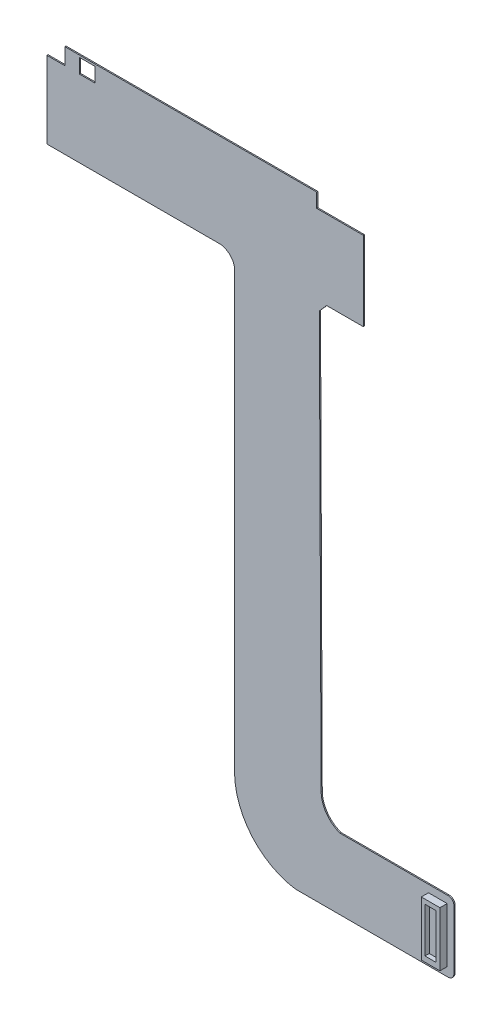
ISO-10303-21;
HEADER;
FILE_DESCRIPTION(('STEP AP214'),'2;1');
FILE_NAME('part.step','',(''),(''),'','','');
FILE_SCHEMA(('AUTOMOTIVE_DESIGN { 1 0 10303 214 1 1 1 1 }'));
ENDSEC;
DATA;
#1=APPLICATION_CONTEXT('core data for automotive mechanical design processes');
#2=APPLICATION_PROTOCOL_DEFINITION('international standard','automotive_design',2000,#1);
#3=PRODUCT_CONTEXT('',#1,'mechanical');
#4=PRODUCT('Part','Part','',(#3));
#5=PRODUCT_RELATED_PRODUCT_CATEGORY('part','',(#4));
#6=PRODUCT_DEFINITION_FORMATION('','',#4);
#7=PRODUCT_DEFINITION_CONTEXT('part definition',#1,'design');
#8=PRODUCT_DEFINITION('design','',#6,#7);
#9=PRODUCT_DEFINITION_SHAPE('','',#8);
#10=(LENGTH_UNIT() NAMED_UNIT(*) SI_UNIT(.MILLI.,.METRE.));
#11=(NAMED_UNIT(*) PLANE_ANGLE_UNIT() SI_UNIT($,.RADIAN.));
#12=(NAMED_UNIT(*) SI_UNIT($,.STERADIAN.) SOLID_ANGLE_UNIT());
#13=UNCERTAINTY_MEASURE_WITH_UNIT(LENGTH_MEASURE(1.E-05),#10,'distance_accuracy_value','');
#14=(GEOMETRIC_REPRESENTATION_CONTEXT(3) GLOBAL_UNCERTAINTY_ASSIGNED_CONTEXT((#13)) GLOBAL_UNIT_ASSIGNED_CONTEXT((#10,
#11,#12)) REPRESENTATION_CONTEXT('',''));
#15=CARTESIAN_POINT('',(0.,0.,0.));
#16=DIRECTION('',(0.,0.,1.));
#17=DIRECTION('',(1.,0.,0.));
#18=AXIS2_PLACEMENT_3D('',#15,#16,#17);
#19=CARTESIAN_POINT('',(153.074119046301,141.992079804937,0.2));
#20=DIRECTION('',(0.,0.,-1.));
#21=DIRECTION('',(-1.,0.,0.));
#22=AXIS2_PLACEMENT_3D('',#19,#20,#21);
#23=PLANE('',#22);
#24=DIRECTION('',(0.,-1.,0.));
#25=VECTOR('',#24,1.);
#26=CARTESIAN_POINT('',(128.905084660618,160.581656664466,0.2));
#27=LINE('',#26,#25);
#28=CARTESIAN_POINT('',(128.905084660618,160.581656664466,0.2));
#29=VERTEX_POINT('',#28);
#30=CARTESIAN_POINT('',(128.905084660618,158.075350221352,0.2));
#31=VERTEX_POINT('',#30);
#32=EDGE_CURVE('E354',#29,#31,#27,.T.);
#33=ORIENTED_EDGE('',*,*,#32,.F.);
#34=DIRECTION('',(-1.,0.,0.));
#35=VECTOR('',#34,1.);
#36=CARTESIAN_POINT('',(128.905084660618,160.581656664466,0.2));
#37=LINE('',#36,#35);
#38=CARTESIAN_POINT('',(131.63078371799,160.581656664466,0.2));
#39=VERTEX_POINT('',#38);
#40=EDGE_CURVE('E365',#39,#29,#37,.T.);
#41=ORIENTED_EDGE('',*,*,#40,.F.);
#42=DIRECTION('',(0.,1.,0.));
#43=VECTOR('',#42,1.);
#44=CARTESIAN_POINT('',(131.63078371799,160.581656664466,0.2));
#45=LINE('',#44,#43);
#46=CARTESIAN_POINT('',(131.63078371799,158.075350221352,0.2));
#47=VERTEX_POINT('',#46);
#48=EDGE_CURVE('E361',#47,#39,#45,.T.);
#49=ORIENTED_EDGE('',*,*,#48,.F.);
#50=DIRECTION('',(1.,0.,0.));
#51=VECTOR('',#50,1.);
#52=CARTESIAN_POINT('',(128.905084660618,158.075350221352,0.2));
#53=LINE('',#52,#51);
#54=EDGE_CURVE('E357',#31,#47,#53,.T.);
#55=ORIENTED_EDGE('',*,*,#54,.F.);
#56=EDGE_LOOP('',(#33,#41,#49,#55));
#57=FACE_BOUND('',#56,.T.);
#58=DIRECTION('',(1.,0.,0.));
#59=VECTOR('',#58,1.);
#60=CARTESIAN_POINT('',(193.829857272871,54.476275086045,0.2));
#61=LINE('',#60,#59);
#62=CARTESIAN_POINT('',(166.335216501354,54.476275086045,0.2));
#63=VERTEX_POINT('',#62);
#64=CARTESIAN_POINT('',(192.829857272871,54.476275086045,0.2));
#65=VERTEX_POINT('',#64);
#66=EDGE_CURVE('E420',#63,#65,#61,.T.);
#67=ORIENTED_EDGE('',*,*,#66,.T.);
#68=CARTESIAN_POINT('',(192.829857272871,55.476275086045,0.2));
#69=DIRECTION('',(0.,0.,-1.));
#70=DIRECTION('',(-1.,0.,0.));
#71=AXIS2_PLACEMENT_3D('',#68,#69,#70);
#72=CIRCLE('',#71,1.);
#73=CARTESIAN_POINT('',(193.829857272871,55.476275086045,0.2));
#74=VERTEX_POINT('',#73);
#75=EDGE_CURVE('E50',#65,#74,#72,.F.);
#76=ORIENTED_EDGE('',*,*,#75,.T.);
#77=DIRECTION('',(0.,1.,0.));
#78=VECTOR('',#77,1.);
#79=CARTESIAN_POINT('',(193.829857272871,66.7210264937508,0.2));
#80=LINE('',#79,#78);
#81=CARTESIAN_POINT('',(193.829857272871,65.7210264937508,0.2));
#82=VERTEX_POINT('',#81);
#83=EDGE_CURVE('E423',#74,#82,#80,.T.);
#84=ORIENTED_EDGE('',*,*,#83,.T.);
#85=CARTESIAN_POINT('',(192.829857272871,65.7210264937508,0.2));
#86=DIRECTION('',(0.,0.,-1.));
#87=DIRECTION('',(-1.,0.,0.));
#88=AXIS2_PLACEMENT_3D('',#85,#86,#87);
#89=CIRCLE('',#88,1.);
#90=CARTESIAN_POINT('',(192.829857272871,66.7210264937508,0.2));
#91=VERTEX_POINT('',#90);
#92=EDGE_CURVE('E57',#82,#91,#89,.F.);
#93=ORIENTED_EDGE('',*,*,#92,.T.);
#94=DIRECTION('',(-1.,0.,0.));
#95=VECTOR('',#94,1.);
#96=CARTESIAN_POINT('',(174.095624510161,66.7210264937508,0.2));
#97=LINE('',#96,#95);
#98=CARTESIAN_POINT('',(174.095624510161,66.7210264937508,0.2));
#99=VERTEX_POINT('',#98);
#100=EDGE_CURVE('E426',#91,#99,#97,.T.);
#101=ORIENTED_EDGE('',*,*,#100,.T.);
#102=CARTESIAN_POINT('',(175.734020057086,71.3549150476266,0.2));
#103=DIRECTION('',(0.,0.,-1.));
#104=DIRECTION('',(1.,0.,0.));
#105=AXIS2_PLACEMENT_3D('',#102,#103,#104);
#106=CIRCLE('',#105,4.91500387567746);
#107=CARTESIAN_POINT('',(170.819971895438,71.2579936210393,0.2));
#108=VERTEX_POINT('',#107);
#109=EDGE_CURVE('E429',#99,#108,#106,.T.);
#110=ORIENTED_EDGE('',*,*,#109,.T.);
#111=DIRECTION('',(-0.00423724986194435,0.999991022816509,0.));
#112=VECTOR('',#111,1.);
#113=CARTESIAN_POINT('',(170.514624307193,143.320028439117,0.2));
#114=LINE('',#113,#112);
#115=CARTESIAN_POINT('',(170.514624307193,143.320028439117,0.2));
#116=VERTEX_POINT('',#115);
#117=EDGE_CURVE('E432',#108,#116,#114,.T.);
#118=ORIENTED_EDGE('',*,*,#117,.T.);
#119=DIRECTION('',(0.660938242989916,0.75044029672813,0.));
#120=VECTOR('',#119,1.);
#121=CARTESIAN_POINT('',(171.779679925594,144.756393672511,0.2));
#122=LINE('',#121,#120);
#123=CARTESIAN_POINT('',(171.779679925594,144.756393672511,0.2));
#124=VERTEX_POINT('',#123);
#125=EDGE_CURVE('E435',#116,#124,#122,.T.);
#126=ORIENTED_EDGE('',*,*,#125,.T.);
#127=DIRECTION('',(1.,0.,0.));
#128=VECTOR('',#127,1.);
#129=CARTESIAN_POINT('',(178.126916217977,144.756393672511,0.2));
#130=LINE('',#129,#128);
#131=CARTESIAN_POINT('',(178.126916217977,144.756393672511,0.2));
#132=VERTEX_POINT('',#131);
#133=EDGE_CURVE('E438',#124,#132,#130,.T.);
#134=ORIENTED_EDGE('',*,*,#133,.T.);
#135=DIRECTION('',(0.,1.,0.));
#136=VECTOR('',#135,1.);
#137=CARTESIAN_POINT('',(178.126916217977,158.481322709896,0.2));
#138=LINE('',#137,#136);
#139=CARTESIAN_POINT('',(178.126916217977,158.481322709896,0.2));
#140=VERTEX_POINT('',#139);
#141=EDGE_CURVE('E441',#132,#140,#138,.T.);
#142=ORIENTED_EDGE('',*,*,#141,.T.);
#143=DIRECTION('',(-1.,0.,0.));
#144=VECTOR('',#143,1.);
#145=CARTESIAN_POINT('',(170.054893457433,158.481322709896,0.2));
#146=LINE('',#145,#144);
#147=CARTESIAN_POINT('',(170.054893457433,158.481322709896,0.2));
#148=VERTEX_POINT('',#147);
#149=EDGE_CURVE('E444',#140,#148,#146,.T.);
#150=ORIENTED_EDGE('',*,*,#149,.T.);
#151=DIRECTION('',(0.,1.,0.));
#152=VECTOR('',#151,1.);
#153=CARTESIAN_POINT('',(170.054893457433,160.932956119521,0.2));
#154=LINE('',#153,#152);
#155=CARTESIAN_POINT('',(170.054893457433,160.932956119521,0.2));
#156=VERTEX_POINT('',#155);
#157=EDGE_CURVE('E447',#148,#156,#154,.T.);
#158=ORIENTED_EDGE('',*,*,#157,.T.);
#159=DIRECTION('',(-1.,0.,0.));
#160=VECTOR('',#159,1.);
#161=CARTESIAN_POINT('',(126.422039537214,160.932956119521,0.2));
#162=LINE('',#161,#160);
#163=CARTESIAN_POINT('',(126.422039537214,160.932956119521,0.2));
#164=VERTEX_POINT('',#163);
#165=EDGE_CURVE('E450',#156,#164,#162,.T.);
#166=ORIENTED_EDGE('',*,*,#165,.T.);
#167=DIRECTION('',(0.,-1.,0.));
#168=VECTOR('',#167,1.);
#169=CARTESIAN_POINT('',(126.422039537214,160.932956119521,0.2));
#170=LINE('',#169,#168);
#171=CARTESIAN_POINT('',(126.422039537214,158.075350221352,0.2));
#172=VERTEX_POINT('',#171);
#173=EDGE_CURVE('E397',#164,#172,#170,.T.);
#174=ORIENTED_EDGE('',*,*,#173,.T.);
#175=DIRECTION('',(-1.,0.,0.));
#176=VECTOR('',#175,1.);
#177=CARTESIAN_POINT('',(126.422039537214,158.075350221352,0.2));
#178=LINE('',#177,#176);
#179=CARTESIAN_POINT('',(123.308343673617,158.075350221352,0.2));
#180=VERTEX_POINT('',#179);
#181=EDGE_CURVE('E401',#172,#180,#178,.T.);
#182=ORIENTED_EDGE('',*,*,#181,.T.);
#183=DIRECTION('',(0.,-1.,0.));
#184=VECTOR('',#183,1.);
#185=CARTESIAN_POINT('',(123.308343673617,158.075350221352,0.2));
#186=LINE('',#185,#184);
#187=CARTESIAN_POINT('',(123.308343673617,144.756393672511,0.2));
#188=VERTEX_POINT('',#187);
#189=EDGE_CURVE('E405',#180,#188,#186,.T.);
#190=ORIENTED_EDGE('',*,*,#189,.T.);
#191=DIRECTION('',(1.,0.,0.));
#192=VECTOR('',#191,1.);
#193=CARTESIAN_POINT('',(123.308343673617,144.756393672511,0.2));
#194=LINE('',#193,#192);
#195=CARTESIAN_POINT('',(153.414150221707,144.756393672511,0.2));
#196=VERTEX_POINT('',#195);
#197=EDGE_CURVE('E408',#188,#196,#194,.T.);
#198=ORIENTED_EDGE('',*,*,#197,.T.);
#199=CARTESIAN_POINT('',(153.074119046301,141.992079804937,0.2));
#200=DIRECTION('',(0.,0.,-1.));
#201=DIRECTION('',(-1.,0.,0.));
#202=AXIS2_PLACEMENT_3D('',#199,#200,#201);
#203=CIRCLE('',#202,2.78514853440714);
#204=CARTESIAN_POINT('',(155.831660908725,142.383251424168,0.2));
#205=VERTEX_POINT('',#204);
#206=EDGE_CURVE('E411',#196,#205,#203,.T.);
#207=ORIENTED_EDGE('',*,*,#206,.T.);
#208=DIRECTION('',(0.,-1.,0.));
#209=VECTOR('',#208,1.);
#210=CARTESIAN_POINT('',(155.831660908725,66.3972708671945,0.2));
#211=LINE('',#210,#209);
#212=CARTESIAN_POINT('',(155.831660908725,66.3972708671945,0.2));
#213=VERTEX_POINT('',#212);
#214=EDGE_CURVE('E414',#205,#213,#211,.T.);
#215=ORIENTED_EDGE('',*,*,#214,.T.);
#216=CARTESIAN_POINT('',(168.202965478713,66.7097678365579,0.2));
#217=DIRECTION('',(0.,0.,1.));
#218=DIRECTION('',(-1.,0.,0.));
#219=AXIS2_PLACEMENT_3D('',#216,#217,#218);
#220=CIRCLE('',#219,12.3752507497537);
#221=EDGE_CURVE('E417',#213,#63,#220,.T.);
#222=ORIENTED_EDGE('',*,*,#221,.T.);
#223=EDGE_LOOP('',(#67,#76,#84,#93,#101,#110,#118,#126,#134,#142,#150,#158,#166,#174,#182,#190,
#198,#207,#215,#222));
#224=FACE_BOUND('',#223,.T.);
#225=DIRECTION('',(0.,1.,0.));
#226=VECTOR('',#225,1.);
#227=CARTESIAN_POINT('',(192.663845875503,65.4511874566621,0.2));
#228=LINE('',#227,#226);
#229=CARTESIAN_POINT('',(192.663845875503,55.9726359954279,0.2));
#230=VERTEX_POINT('',#229);
#231=CARTESIAN_POINT('',(192.663845875503,65.4511874566621,0.2));
#232=VERTEX_POINT('',#231);
#233=EDGE_CURVE('E303',#230,#232,#228,.T.);
#234=ORIENTED_EDGE('',*,*,#233,.F.);
#235=DIRECTION('',(1.,0.,0.));
#236=VECTOR('',#235,1.);
#237=CARTESIAN_POINT('',(192.663845875503,55.9726359954279,0.2));
#238=LINE('',#237,#236);
#239=CARTESIAN_POINT('',(189.428922584437,55.9726359954279,0.2));
#240=VERTEX_POINT('',#239);
#241=EDGE_CURVE('E314',#240,#230,#238,.T.);
#242=ORIENTED_EDGE('',*,*,#241,.F.);
#243=DIRECTION('',(0.,-1.,0.));
#244=VECTOR('',#243,1.);
#245=CARTESIAN_POINT('',(189.428922584437,65.4511874566621,0.2));
#246=LINE('',#245,#244);
#247=CARTESIAN_POINT('',(189.428922584437,65.4511874566621,0.2));
#248=VERTEX_POINT('',#247);
#249=EDGE_CURVE('E331',#248,#240,#246,.T.);
#250=ORIENTED_EDGE('',*,*,#249,.F.);
#251=DIRECTION('',(-1.,0.,0.));
#252=VECTOR('',#251,1.);
#253=CARTESIAN_POINT('',(192.663845875503,65.4511874566621,0.2));
#254=LINE('',#253,#252);
#255=EDGE_CURVE('E327',#232,#248,#254,.T.);
#256=ORIENTED_EDGE('',*,*,#255,.F.);
#257=EDGE_LOOP('',(#234,#242,#250,#256));
#258=FACE_BOUND('',#257,.T.);
#259=ADVANCED_FACE('F41',(#57,#224,#258),#23,.F.);
#260=CARTESIAN_POINT('',(153.074119046301,141.992079804937,0.));
#261=DIRECTION('',(0.,0.,-1.));
#262=DIRECTION('',(-1.,0.,0.));
#263=AXIS2_PLACEMENT_3D('',#260,#261,#262);
#264=PLANE('',#263);
#265=DIRECTION('',(0.,1.,0.));
#266=VECTOR('',#265,1.);
#267=CARTESIAN_POINT('',(193.829857272871,66.7210264937508,0.));
#268=LINE('',#267,#266);
#269=CARTESIAN_POINT('',(193.829857272871,55.476275086045,0.));
#270=VERTEX_POINT('',#269);
#271=CARTESIAN_POINT('',(193.829857272871,65.7210264937508,0.));
#272=VERTEX_POINT('',#271);
#273=EDGE_CURVE('E478',#270,#272,#268,.T.);
#274=ORIENTED_EDGE('',*,*,#273,.F.);
#275=CARTESIAN_POINT('',(192.829857272871,55.476275086045,0.));
#276=DIRECTION('',(0.,0.,-1.));
#277=DIRECTION('',(-1.,0.,0.));
#278=AXIS2_PLACEMENT_3D('',#275,#276,#277);
#279=CIRCLE('',#278,1.);
#280=CARTESIAN_POINT('',(192.829857272871,54.476275086045,0.));
#281=VERTEX_POINT('',#280);
#282=EDGE_CURVE('E581',#270,#281,#279,.T.);
#283=ORIENTED_EDGE('',*,*,#282,.T.);
#284=DIRECTION('',(1.,0.,0.));
#285=VECTOR('',#284,1.);
#286=CARTESIAN_POINT('',(193.829857272871,54.476275086045,0.));
#287=LINE('',#286,#285);
#288=CARTESIAN_POINT('',(166.335216501354,54.476275086045,0.));
#289=VERTEX_POINT('',#288);
#290=EDGE_CURVE('E475',#289,#281,#287,.T.);
#291=ORIENTED_EDGE('',*,*,#290,.F.);
#292=CARTESIAN_POINT('',(168.202965478713,66.7097678365579,0.));
#293=DIRECTION('',(0.,0.,1.));
#294=DIRECTION('',(-1.,0.,0.));
#295=AXIS2_PLACEMENT_3D('',#292,#293,#294);
#296=CIRCLE('',#295,12.3752507497537);
#297=CARTESIAN_POINT('',(155.831660908725,66.3972708671945,0.));
#298=VERTEX_POINT('',#297);
#299=EDGE_CURVE('E472',#298,#289,#296,.T.);
#300=ORIENTED_EDGE('',*,*,#299,.F.);
#301=DIRECTION('',(0.,-1.,0.));
#302=VECTOR('',#301,1.);
#303=CARTESIAN_POINT('',(155.831660908725,66.3972708671945,0.));
#304=LINE('',#303,#302);
#305=CARTESIAN_POINT('',(155.831660908725,142.383251424168,0.));
#306=VERTEX_POINT('',#305);
#307=EDGE_CURVE('E469',#306,#298,#304,.T.);
#308=ORIENTED_EDGE('',*,*,#307,.F.);
#309=CARTESIAN_POINT('',(153.074119046301,141.992079804937,0.));
#310=DIRECTION('',(0.,0.,-1.));
#311=DIRECTION('',(-1.,0.,0.));
#312=AXIS2_PLACEMENT_3D('',#309,#310,#311);
#313=CIRCLE('',#312,2.78514853440714);
#314=CARTESIAN_POINT('',(153.414150221707,144.756393672511,0.));
#315=VERTEX_POINT('',#314);
#316=EDGE_CURVE('E466',#315,#306,#313,.T.);
#317=ORIENTED_EDGE('',*,*,#316,.F.);
#318=DIRECTION('',(1.,0.,0.));
#319=VECTOR('',#318,1.);
#320=CARTESIAN_POINT('',(123.308343673617,144.756393672511,0.));
#321=LINE('',#320,#319);
#322=CARTESIAN_POINT('',(123.308343673617,144.756393672511,0.));
#323=VERTEX_POINT('',#322);
#324=EDGE_CURVE('E463',#323,#315,#321,.T.);
#325=ORIENTED_EDGE('',*,*,#324,.F.);
#326=DIRECTION('',(0.,-1.,0.));
#327=VECTOR('',#326,1.);
#328=CARTESIAN_POINT('',(123.308343673617,158.075350221352,0.));
#329=LINE('',#328,#327);
#330=CARTESIAN_POINT('',(123.308343673617,158.075350221352,0.));
#331=VERTEX_POINT('',#330);
#332=EDGE_CURVE('E460',#331,#323,#329,.T.);
#333=ORIENTED_EDGE('',*,*,#332,.F.);
#334=DIRECTION('',(-1.,0.,0.));
#335=VECTOR('',#334,1.);
#336=CARTESIAN_POINT('',(126.422039537214,158.075350221352,0.));
#337=LINE('',#336,#335);
#338=CARTESIAN_POINT('',(126.422039537214,158.075350221352,0.));
#339=VERTEX_POINT('',#338);
#340=EDGE_CURVE('E457',#339,#331,#337,.T.);
#341=ORIENTED_EDGE('',*,*,#340,.F.);
#342=DIRECTION('',(0.,-1.,0.));
#343=VECTOR('',#342,1.);
#344=CARTESIAN_POINT('',(126.422039537214,160.932956119521,0.));
#345=LINE('',#344,#343);
#346=CARTESIAN_POINT('',(126.422039537214,160.932956119521,0.));
#347=VERTEX_POINT('',#346);
#348=EDGE_CURVE('E396',#347,#339,#345,.T.);
#349=ORIENTED_EDGE('',*,*,#348,.F.);
#350=DIRECTION('',(-1.,0.,0.));
#351=VECTOR('',#350,1.);
#352=CARTESIAN_POINT('',(126.422039537214,160.932956119521,0.));
#353=LINE('',#352,#351);
#354=CARTESIAN_POINT('',(170.054893457433,160.932956119521,0.));
#355=VERTEX_POINT('',#354);
#356=EDGE_CURVE('E402',#355,#347,#353,.T.);
#357=ORIENTED_EDGE('',*,*,#356,.F.);
#358=DIRECTION('',(0.,1.,0.));
#359=VECTOR('',#358,1.);
#360=CARTESIAN_POINT('',(170.054893457433,160.932956119521,0.));
#361=LINE('',#360,#359);
#362=CARTESIAN_POINT('',(170.054893457433,158.481322709896,0.));
#363=VERTEX_POINT('',#362);
#364=EDGE_CURVE('E503',#363,#355,#361,.T.);
#365=ORIENTED_EDGE('',*,*,#364,.F.);
#366=DIRECTION('',(-1.,0.,0.));
#367=VECTOR('',#366,1.);
#368=CARTESIAN_POINT('',(170.054893457433,158.481322709896,0.));
#369=LINE('',#368,#367);
#370=CARTESIAN_POINT('',(178.126916217977,158.481322709896,0.));
#371=VERTEX_POINT('',#370);
#372=EDGE_CURVE('E500',#371,#363,#369,.T.);
#373=ORIENTED_EDGE('',*,*,#372,.F.);
#374=DIRECTION('',(0.,1.,0.));
#375=VECTOR('',#374,1.);
#376=CARTESIAN_POINT('',(178.126916217977,158.481322709896,0.));
#377=LINE('',#376,#375);
#378=CARTESIAN_POINT('',(178.126916217977,144.756393672511,0.));
#379=VERTEX_POINT('',#378);
#380=EDGE_CURVE('E497',#379,#371,#377,.T.);
#381=ORIENTED_EDGE('',*,*,#380,.F.);
#382=DIRECTION('',(1.,0.,0.));
#383=VECTOR('',#382,1.);
#384=CARTESIAN_POINT('',(178.126916217977,144.756393672511,0.));
#385=LINE('',#384,#383);
#386=CARTESIAN_POINT('',(171.779679925594,144.756393672511,0.));
#387=VERTEX_POINT('',#386);
#388=EDGE_CURVE('E494',#387,#379,#385,.T.);
#389=ORIENTED_EDGE('',*,*,#388,.F.);
#390=DIRECTION('',(0.660938242989916,0.75044029672813,0.));
#391=VECTOR('',#390,1.);
#392=CARTESIAN_POINT('',(171.779679925594,144.756393672511,0.));
#393=LINE('',#392,#391);
#394=CARTESIAN_POINT('',(170.514624307193,143.320028439117,0.));
#395=VERTEX_POINT('',#394);
#396=EDGE_CURVE('E491',#395,#387,#393,.T.);
#397=ORIENTED_EDGE('',*,*,#396,.F.);
#398=DIRECTION('',(-0.00423724986194435,0.999991022816509,0.));
#399=VECTOR('',#398,1.);
#400=CARTESIAN_POINT('',(170.514624307193,143.320028439117,0.));
#401=LINE('',#400,#399);
#402=CARTESIAN_POINT('',(170.819971895438,71.2579936210393,0.));
#403=VERTEX_POINT('',#402);
#404=EDGE_CURVE('E488',#403,#395,#401,.T.);
#405=ORIENTED_EDGE('',*,*,#404,.F.);
#406=CARTESIAN_POINT('',(175.734020057086,71.3549150476266,0.));
#407=DIRECTION('',(0.,0.,-1.));
#408=DIRECTION('',(1.,0.,0.));
#409=AXIS2_PLACEMENT_3D('',#406,#407,#408);
#410=CIRCLE('',#409,4.91500387567746);
#411=CARTESIAN_POINT('',(174.095624510161,66.7210264937508,0.));
#412=VERTEX_POINT('',#411);
#413=EDGE_CURVE('E485',#412,#403,#410,.T.);
#414=ORIENTED_EDGE('',*,*,#413,.F.);
#415=DIRECTION('',(-1.,0.,0.));
#416=VECTOR('',#415,1.);
#417=CARTESIAN_POINT('',(174.095624510161,66.7210264937508,0.));
#418=LINE('',#417,#416);
#419=CARTESIAN_POINT('',(192.829857272871,66.7210264937508,0.));
#420=VERTEX_POINT('',#419);
#421=EDGE_CURVE('E482',#420,#412,#418,.T.);
#422=ORIENTED_EDGE('',*,*,#421,.F.);
#423=CARTESIAN_POINT('',(192.829857272871,65.7210264937508,0.));
#424=DIRECTION('',(0.,0.,-1.));
#425=DIRECTION('',(-1.,0.,0.));
#426=AXIS2_PLACEMENT_3D('',#423,#424,#425);
#427=CIRCLE('',#426,1.);
#428=EDGE_CURVE('E578',#420,#272,#427,.T.);
#429=ORIENTED_EDGE('',*,*,#428,.T.);
#430=EDGE_LOOP('',(#274,#283,#291,#300,#308,#317,#325,#333,#341,#349,#357,#365,#373,#381,#389,
#397,#405,#414,#422,#429));
#431=FACE_BOUND('',#430,.T.);
#432=DIRECTION('',(-1.,0.,0.));
#433=VECTOR('',#432,1.);
#434=CARTESIAN_POINT('',(128.905084660618,160.581656664466,0.));
#435=LINE('',#434,#433);
#436=CARTESIAN_POINT('',(131.63078371799,160.581656664466,0.));
#437=VERTEX_POINT('',#436);
#438=CARTESIAN_POINT('',(128.905084660618,160.581656664466,0.));
#439=VERTEX_POINT('',#438);
#440=EDGE_CURVE('E358',#437,#439,#435,.T.);
#441=ORIENTED_EDGE('',*,*,#440,.T.);
#442=DIRECTION('',(0.,-1.,0.));
#443=VECTOR('',#442,1.);
#444=CARTESIAN_POINT('',(128.905084660618,160.581656664466,0.));
#445=LINE('',#444,#443);
#446=CARTESIAN_POINT('',(128.905084660618,158.075350221352,0.));
#447=VERTEX_POINT('',#446);
#448=EDGE_CURVE('E353',#439,#447,#445,.T.);
#449=ORIENTED_EDGE('',*,*,#448,.T.);
#450=DIRECTION('',(1.,0.,0.));
#451=VECTOR('',#450,1.);
#452=CARTESIAN_POINT('',(128.905084660618,158.075350221352,0.));
#453=LINE('',#452,#451);
#454=CARTESIAN_POINT('',(131.63078371799,158.075350221352,0.));
#455=VERTEX_POINT('',#454);
#456=EDGE_CURVE('E372',#447,#455,#453,.T.);
#457=ORIENTED_EDGE('',*,*,#456,.T.);
#458=DIRECTION('',(0.,1.,0.));
#459=VECTOR('',#458,1.);
#460=CARTESIAN_POINT('',(131.63078371799,160.581656664466,0.));
#461=LINE('',#460,#459);
#462=EDGE_CURVE('E376',#455,#437,#461,.T.);
#463=ORIENTED_EDGE('',*,*,#462,.T.);
#464=EDGE_LOOP('',(#441,#449,#457,#463));
#465=FACE_BOUND('',#464,.T.);
#466=ADVANCED_FACE('F600',(#431,#465),#264,.T.);
#467=CARTESIAN_POINT('',(126.422039537214,160.932956119521,0.2));
#468=DIRECTION('',(1.,0.,0.));
#469=DIRECTION('',(0.,0.,-1.));
#470=AXIS2_PLACEMENT_3D('',#467,#468,#469);
#471=PLANE('',#470);
#472=ORIENTED_EDGE('',*,*,#348,.T.);
#473=DIRECTION('',(0.,0.,-1.));
#474=VECTOR('',#473,1.);
#475=CARTESIAN_POINT('',(126.422039537214,158.075350221352,0.2));
#476=LINE('',#475,#474);
#477=EDGE_CURVE('E567',#172,#339,#476,.T.);
#478=ORIENTED_EDGE('',*,*,#477,.F.);
#479=ORIENTED_EDGE('',*,*,#173,.F.);
#480=DIRECTION('',(0.,0.,-1.));
#481=VECTOR('',#480,1.);
#482=CARTESIAN_POINT('',(126.422039537214,160.932956119521,0.2));
#483=LINE('',#482,#481);
#484=EDGE_CURVE('E453',#164,#347,#483,.T.);
#485=ORIENTED_EDGE('',*,*,#484,.T.);
#486=EDGE_LOOP('',(#472,#478,#479,#485));
#487=FACE_BOUND('',#486,.T.);
#488=ADVANCED_FACE('F635',(#487),#471,.F.);
#489=CARTESIAN_POINT('',(126.422039537214,158.075350221352,0.2));
#490=DIRECTION('',(0.,-1.,0.));
#491=DIRECTION('',(0.,0.,-1.));
#492=AXIS2_PLACEMENT_3D('',#489,#490,#491);
#493=PLANE('',#492);
#494=ORIENTED_EDGE('',*,*,#340,.T.);
#495=DIRECTION('',(0.,0.,-1.));
#496=VECTOR('',#495,1.);
#497=CARTESIAN_POINT('',(123.308343673617,158.075350221352,0.2));
#498=LINE('',#497,#496);
#499=EDGE_CURVE('E563',#180,#331,#498,.T.);
#500=ORIENTED_EDGE('',*,*,#499,.F.);
#501=ORIENTED_EDGE('',*,*,#181,.F.);
#502=ORIENTED_EDGE('',*,*,#477,.T.);
#503=EDGE_LOOP('',(#494,#500,#501,#502));
#504=FACE_BOUND('',#503,.T.);
#505=ADVANCED_FACE('F631',(#504),#493,.F.);
#506=CARTESIAN_POINT('',(123.308343673617,158.075350221352,0.2));
#507=DIRECTION('',(1.,0.,0.));
#508=DIRECTION('',(0.,0.,-1.));
#509=AXIS2_PLACEMENT_3D('',#506,#507,#508);
#510=PLANE('',#509);
#511=ORIENTED_EDGE('',*,*,#332,.T.);
#512=DIRECTION('',(0.,0.,-1.));
#513=VECTOR('',#512,1.);
#514=CARTESIAN_POINT('',(123.308343673617,144.756393672511,0.2));
#515=LINE('',#514,#513);
#516=EDGE_CURVE('E559',#188,#323,#515,.T.);
#517=ORIENTED_EDGE('',*,*,#516,.F.);
#518=ORIENTED_EDGE('',*,*,#189,.F.);
#519=ORIENTED_EDGE('',*,*,#499,.T.);
#520=EDGE_LOOP('',(#511,#517,#518,#519));
#521=FACE_BOUND('',#520,.T.);
#522=ADVANCED_FACE('F627',(#521),#510,.F.);
#523=CARTESIAN_POINT('',(123.308343673617,144.756393672511,0.2));
#524=DIRECTION('',(0.,1.,0.));
#525=DIRECTION('',(0.,0.,1.));
#526=AXIS2_PLACEMENT_3D('',#523,#524,#525);
#527=PLANE('',#526);
#528=ORIENTED_EDGE('',*,*,#324,.T.);
#529=DIRECTION('',(0.,0.,-1.));
#530=VECTOR('',#529,1.);
#531=CARTESIAN_POINT('',(153.414150221707,144.756393672511,0.2));
#532=LINE('',#531,#530);
#533=EDGE_CURVE('E555',#196,#315,#532,.T.);
#534=ORIENTED_EDGE('',*,*,#533,.F.);
#535=ORIENTED_EDGE('',*,*,#197,.F.);
#536=ORIENTED_EDGE('',*,*,#516,.T.);
#537=EDGE_LOOP('',(#528,#534,#535,#536));
#538=FACE_BOUND('',#537,.T.);
#539=ADVANCED_FACE('F622',(#538),#527,.F.);
#540=CARTESIAN_POINT('',(153.074119046301,141.992079804937,0.2));
#541=DIRECTION('',(0.,0.,-1.));
#542=DIRECTION('',(-1.,0.,0.));
#543=AXIS2_PLACEMENT_3D('',#540,#541,#542);
#544=CYLINDRICAL_SURFACE('',#543,2.78514853440714);
#545=ORIENTED_EDGE('',*,*,#316,.T.);
#546=DIRECTION('',(0.,0.,-1.));
#547=VECTOR('',#546,1.);
#548=CARTESIAN_POINT('',(155.831660908725,142.383251424168,0.2));
#549=LINE('',#548,#547);
#550=EDGE_CURVE('E551',#205,#306,#549,.T.);
#551=ORIENTED_EDGE('',*,*,#550,.F.);
#552=ORIENTED_EDGE('',*,*,#206,.F.);
#553=ORIENTED_EDGE('',*,*,#533,.T.);
#554=EDGE_LOOP('',(#545,#551,#552,#553));
#555=FACE_BOUND('',#554,.T.);
#556=ADVANCED_FACE('F618',(#555),#544,.F.);
#557=CARTESIAN_POINT('',(155.831660908725,66.3972708671945,0.2));
#558=DIRECTION('',(1.,0.,0.));
#559=DIRECTION('',(0.,0.,-1.));
#560=AXIS2_PLACEMENT_3D('',#557,#558,#559);
#561=PLANE('',#560);
#562=ORIENTED_EDGE('',*,*,#307,.T.);
#563=DIRECTION('',(0.,0.,-1.));
#564=VECTOR('',#563,1.);
#565=CARTESIAN_POINT('',(155.831660908725,66.3972708671945,0.2));
#566=LINE('',#565,#564);
#567=EDGE_CURVE('E547',#213,#298,#566,.T.);
#568=ORIENTED_EDGE('',*,*,#567,.F.);
#569=ORIENTED_EDGE('',*,*,#214,.F.);
#570=ORIENTED_EDGE('',*,*,#550,.T.);
#571=EDGE_LOOP('',(#562,#568,#569,#570));
#572=FACE_BOUND('',#571,.T.);
#573=ADVANCED_FACE('F613',(#572),#561,.F.);
#574=CARTESIAN_POINT('',(168.202965478713,66.7097678365579,0.2));
#575=DIRECTION('',(0.,0.,-1.));
#576=DIRECTION('',(-1.,0.,0.));
#577=AXIS2_PLACEMENT_3D('',#574,#575,#576);
#578=CYLINDRICAL_SURFACE('',#577,12.3752507497537);
#579=ORIENTED_EDGE('',*,*,#299,.T.);
#580=DIRECTION('',(0.,0.,-1.));
#581=VECTOR('',#580,1.);
#582=CARTESIAN_POINT('',(166.335216501354,54.476275086045,0.2));
#583=LINE('',#582,#581);
#584=EDGE_CURVE('E543',#63,#289,#583,.T.);
#585=ORIENTED_EDGE('',*,*,#584,.F.);
#586=ORIENTED_EDGE('',*,*,#221,.F.);
#587=ORIENTED_EDGE('',*,*,#567,.T.);
#588=EDGE_LOOP('',(#579,#585,#586,#587));
#589=FACE_BOUND('',#588,.T.);
#590=ADVANCED_FACE('F607',(#589),#578,.T.);
#591=CARTESIAN_POINT('',(193.829857272871,54.476275086045,0.2));
#592=DIRECTION('',(0.,1.,0.));
#593=DIRECTION('',(0.,0.,1.));
#594=AXIS2_PLACEMENT_3D('',#591,#592,#593);
#595=PLANE('',#594);
#596=ORIENTED_EDGE('',*,*,#290,.T.);
#597=DIRECTION('',(0.,0.,-1.));
#598=VECTOR('',#597,1.);
#599=CARTESIAN_POINT('',(192.829857272871,54.476275086045,0.2));
#600=LINE('',#599,#598);
#601=EDGE_CURVE('E65',#281,#65,#600,.F.);
#602=ORIENTED_EDGE('',*,*,#601,.T.);
#603=ORIENTED_EDGE('',*,*,#66,.F.);
#604=ORIENTED_EDGE('',*,*,#584,.T.);
#605=EDGE_LOOP('',(#596,#602,#603,#604));
#606=FACE_BOUND('',#605,.T.);
#607=ADVANCED_FACE('F603',(#606),#595,.F.);
#608=CARTESIAN_POINT('',(193.829857272871,66.7210264937508,0.2));
#609=DIRECTION('',(-1.,0.,0.));
#610=DIRECTION('',(0.,0.,1.));
#611=AXIS2_PLACEMENT_3D('',#608,#609,#610);
#612=PLANE('',#611);
#613=ORIENTED_EDGE('',*,*,#83,.F.);
#614=DIRECTION('',(0.,0.,-1.));
#615=VECTOR('',#614,1.);
#616=CARTESIAN_POINT('',(193.829857272871,55.476275086045,0.2));
#617=LINE('',#616,#615);
#618=EDGE_CURVE('E574',#74,#270,#617,.T.);
#619=ORIENTED_EDGE('',*,*,#618,.T.);
#620=ORIENTED_EDGE('',*,*,#273,.T.);
#621=DIRECTION('',(0.,0.,-1.));
#622=VECTOR('',#621,1.);
#623=CARTESIAN_POINT('',(193.829857272871,65.7210264937508,0.2));
#624=LINE('',#623,#622);
#625=EDGE_CURVE('E571',#272,#82,#624,.F.);
#626=ORIENTED_EDGE('',*,*,#625,.T.);
#627=EDGE_LOOP('',(#613,#619,#620,#626));
#628=FACE_BOUND('',#627,.T.);
#629=ADVANCED_FACE('F594',(#628),#612,.F.);
#630=CARTESIAN_POINT('',(174.095624510161,66.7210264937508,0.2));
#631=DIRECTION('',(0.,-1.,0.));
#632=DIRECTION('',(0.,0.,-1.));
#633=AXIS2_PLACEMENT_3D('',#630,#631,#632);
#634=PLANE('',#633);
#635=ORIENTED_EDGE('',*,*,#100,.F.);
#636=DIRECTION('',(0.,0.,-1.));
#637=VECTOR('',#636,1.);
#638=CARTESIAN_POINT('',(192.829857272871,66.7210264937508,0.2));
#639=LINE('',#638,#637);
#640=EDGE_CURVE('E11',#91,#420,#639,.T.);
#641=ORIENTED_EDGE('',*,*,#640,.T.);
#642=ORIENTED_EDGE('',*,*,#421,.T.);
#643=DIRECTION('',(0.,0.,-1.));
#644=VECTOR('',#643,1.);
#645=CARTESIAN_POINT('',(174.095624510161,66.7210264937508,0.2));
#646=LINE('',#645,#644);
#647=EDGE_CURVE('E539',#99,#412,#646,.T.);
#648=ORIENTED_EDGE('',*,*,#647,.F.);
#649=EDGE_LOOP('',(#635,#641,#642,#648));
#650=FACE_BOUND('',#649,.T.);
#651=ADVANCED_FACE('F679',(#650),#634,.F.);
#652=CARTESIAN_POINT('',(175.734020057086,71.3549150476266,0.2));
#653=DIRECTION('',(0.,0.,-1.));
#654=DIRECTION('',(-1.,0.,0.));
#655=AXIS2_PLACEMENT_3D('',#652,#653,#654);
#656=CYLINDRICAL_SURFACE('',#655,4.91500387567746);
#657=ORIENTED_EDGE('',*,*,#413,.T.);
#658=DIRECTION('',(0.,0.,-1.));
#659=VECTOR('',#658,1.);
#660=CARTESIAN_POINT('',(170.819971895438,71.2579936210393,0.2));
#661=LINE('',#660,#659);
#662=EDGE_CURVE('E535',#108,#403,#661,.T.);
#663=ORIENTED_EDGE('',*,*,#662,.F.);
#664=ORIENTED_EDGE('',*,*,#109,.F.);
#665=ORIENTED_EDGE('',*,*,#647,.T.);
#666=EDGE_LOOP('',(#657,#663,#664,#665));
#667=FACE_BOUND('',#666,.T.);
#668=ADVANCED_FACE('F676',(#667),#656,.F.);
#669=CARTESIAN_POINT('',(170.514624307193,143.320028439117,0.2));
#670=DIRECTION('',(-0.999991022816509,-0.00423724986194435,0.));
#671=DIRECTION('',(0.00423724986194435,-0.999991022816509,0.));
#672=AXIS2_PLACEMENT_3D('',#669,#670,#671);
#673=PLANE('',#672);
#674=ORIENTED_EDGE('',*,*,#404,.T.);
#675=DIRECTION('',(0.,0.,-1.));
#676=VECTOR('',#675,1.);
#677=CARTESIAN_POINT('',(170.514624307193,143.320028439117,0.2));
#678=LINE('',#677,#676);
#679=EDGE_CURVE('E531',#116,#395,#678,.T.);
#680=ORIENTED_EDGE('',*,*,#679,.F.);
#681=ORIENTED_EDGE('',*,*,#117,.F.);
#682=ORIENTED_EDGE('',*,*,#662,.T.);
#683=EDGE_LOOP('',(#674,#680,#681,#682));
#684=FACE_BOUND('',#683,.T.);
#685=ADVANCED_FACE('F671',(#684),#673,.F.);
#686=CARTESIAN_POINT('',(171.779679925594,144.756393672511,0.2));
#687=DIRECTION('',(-0.75044029672813,0.660938242989916,0.));
#688=DIRECTION('',(-0.660938242989916,-0.75044029672813,0.));
#689=AXIS2_PLACEMENT_3D('',#686,#687,#688);
#690=PLANE('',#689);
#691=ORIENTED_EDGE('',*,*,#396,.T.);
#692=DIRECTION('',(0.,0.,-1.));
#693=VECTOR('',#692,1.);
#694=CARTESIAN_POINT('',(171.779679925594,144.756393672511,0.2));
#695=LINE('',#694,#693);
#696=EDGE_CURVE('E527',#124,#387,#695,.T.);
#697=ORIENTED_EDGE('',*,*,#696,.F.);
#698=ORIENTED_EDGE('',*,*,#125,.F.);
#699=ORIENTED_EDGE('',*,*,#679,.T.);
#700=EDGE_LOOP('',(#691,#697,#698,#699));
#701=FACE_BOUND('',#700,.T.);
#702=ADVANCED_FACE('F665',(#701),#690,.F.);
#703=CARTESIAN_POINT('',(178.126916217977,144.756393672511,0.2));
#704=DIRECTION('',(0.,1.,0.));
#705=DIRECTION('',(0.,0.,1.));
#706=AXIS2_PLACEMENT_3D('',#703,#704,#705);
#707=PLANE('',#706);
#708=ORIENTED_EDGE('',*,*,#388,.T.);
#709=DIRECTION('',(0.,0.,-1.));
#710=VECTOR('',#709,1.);
#711=CARTESIAN_POINT('',(178.126916217977,144.756393672511,0.2));
#712=LINE('',#711,#710);
#713=EDGE_CURVE('E523',#132,#379,#712,.T.);
#714=ORIENTED_EDGE('',*,*,#713,.F.);
#715=ORIENTED_EDGE('',*,*,#133,.F.);
#716=ORIENTED_EDGE('',*,*,#696,.T.);
#717=EDGE_LOOP('',(#708,#714,#715,#716));
#718=FACE_BOUND('',#717,.T.);
#719=ADVANCED_FACE('F661',(#718),#707,.F.);
#720=CARTESIAN_POINT('',(178.126916217977,158.481322709896,0.2));
#721=DIRECTION('',(-1.,0.,0.));
#722=DIRECTION('',(0.,0.,1.));
#723=AXIS2_PLACEMENT_3D('',#720,#721,#722);
#724=PLANE('',#723);
#725=ORIENTED_EDGE('',*,*,#380,.T.);
#726=DIRECTION('',(0.,0.,-1.));
#727=VECTOR('',#726,1.);
#728=CARTESIAN_POINT('',(178.126916217977,158.481322709896,0.2));
#729=LINE('',#728,#727);
#730=EDGE_CURVE('E519',#140,#371,#729,.T.);
#731=ORIENTED_EDGE('',*,*,#730,.F.);
#732=ORIENTED_EDGE('',*,*,#141,.F.);
#733=ORIENTED_EDGE('',*,*,#713,.T.);
#734=EDGE_LOOP('',(#725,#731,#732,#733));
#735=FACE_BOUND('',#734,.T.);
#736=ADVANCED_FACE('F656',(#735),#724,.F.);
#737=CARTESIAN_POINT('',(170.054893457433,158.481322709896,0.2));
#738=DIRECTION('',(0.,-1.,0.));
#739=DIRECTION('',(0.,0.,-1.));
#740=AXIS2_PLACEMENT_3D('',#737,#738,#739);
#741=PLANE('',#740);
#742=ORIENTED_EDGE('',*,*,#372,.T.);
#743=DIRECTION('',(0.,0.,-1.));
#744=VECTOR('',#743,1.);
#745=CARTESIAN_POINT('',(170.054893457433,158.481322709896,0.2));
#746=LINE('',#745,#744);
#747=EDGE_CURVE('E515',#148,#363,#746,.T.);
#748=ORIENTED_EDGE('',*,*,#747,.F.);
#749=ORIENTED_EDGE('',*,*,#149,.F.);
#750=ORIENTED_EDGE('',*,*,#730,.T.);
#751=EDGE_LOOP('',(#742,#748,#749,#750));
#752=FACE_BOUND('',#751,.T.);
#753=ADVANCED_FACE('F650',(#752),#741,.F.);
#754=CARTESIAN_POINT('',(170.054893457433,160.932956119521,0.2));
#755=DIRECTION('',(-1.,0.,0.));
#756=DIRECTION('',(0.,0.,1.));
#757=AXIS2_PLACEMENT_3D('',#754,#755,#756);
#758=PLANE('',#757);
#759=ORIENTED_EDGE('',*,*,#364,.T.);
#760=DIRECTION('',(0.,0.,-1.));
#761=VECTOR('',#760,1.);
#762=CARTESIAN_POINT('',(170.054893457433,160.932956119521,0.2));
#763=LINE('',#762,#761);
#764=EDGE_CURVE('E511',#156,#355,#763,.T.);
#765=ORIENTED_EDGE('',*,*,#764,.F.);
#766=ORIENTED_EDGE('',*,*,#157,.F.);
#767=ORIENTED_EDGE('',*,*,#747,.T.);
#768=EDGE_LOOP('',(#759,#765,#766,#767));
#769=FACE_BOUND('',#768,.T.);
#770=ADVANCED_FACE('F646',(#769),#758,.F.);
#771=CARTESIAN_POINT('',(126.422039537214,160.932956119521,0.2));
#772=DIRECTION('',(0.,-1.,0.));
#773=DIRECTION('',(0.,0.,-1.));
#774=AXIS2_PLACEMENT_3D('',#771,#772,#773);
#775=PLANE('',#774);
#776=ORIENTED_EDGE('',*,*,#356,.T.);
#777=ORIENTED_EDGE('',*,*,#484,.F.);
#778=ORIENTED_EDGE('',*,*,#165,.F.);
#779=ORIENTED_EDGE('',*,*,#764,.T.);
#780=EDGE_LOOP('',(#776,#777,#778,#779));
#781=FACE_BOUND('',#780,.T.);
#782=ADVANCED_FACE('F641',(#781),#775,.F.);
#783=CARTESIAN_POINT('',(128.905084660618,160.581656664466,0.2));
#784=DIRECTION('',(1.,0.,0.));
#785=DIRECTION('',(0.,0.,-1.));
#786=AXIS2_PLACEMENT_3D('',#783,#784,#785);
#787=PLANE('',#786);
#788=ORIENTED_EDGE('',*,*,#448,.F.);
#789=DIRECTION('',(0.,0.,-1.));
#790=VECTOR('',#789,1.);
#791=CARTESIAN_POINT('',(128.905084660618,160.581656664466,0.2));
#792=LINE('',#791,#790);
#793=EDGE_CURVE('E368',#29,#439,#792,.T.);
#794=ORIENTED_EDGE('',*,*,#793,.F.);
#795=ORIENTED_EDGE('',*,*,#32,.T.);
#796=DIRECTION('',(0.,0.,-1.));
#797=VECTOR('',#796,1.);
#798=CARTESIAN_POINT('',(128.905084660618,158.075350221352,0.2));
#799=LINE('',#798,#797);
#800=EDGE_CURVE('E392',#31,#447,#799,.T.);
#801=ORIENTED_EDGE('',*,*,#800,.T.);
#802=EDGE_LOOP('',(#788,#794,#795,#801));
#803=FACE_BOUND('',#802,.T.);
#804=ADVANCED_FACE('F696',(#803),#787,.T.);
#805=CARTESIAN_POINT('',(128.905084660618,158.075350221352,0.2));
#806=DIRECTION('',(0.,1.,0.));
#807=DIRECTION('',(0.,0.,1.));
#808=AXIS2_PLACEMENT_3D('',#805,#806,#807);
#809=PLANE('',#808);
#810=ORIENTED_EDGE('',*,*,#456,.F.);
#811=ORIENTED_EDGE('',*,*,#800,.F.);
#812=ORIENTED_EDGE('',*,*,#54,.T.);
#813=DIRECTION('',(0.,0.,-1.));
#814=VECTOR('',#813,1.);
#815=CARTESIAN_POINT('',(131.63078371799,158.075350221352,0.2));
#816=LINE('',#815,#814);
#817=EDGE_CURVE('E389',#47,#455,#816,.T.);
#818=ORIENTED_EDGE('',*,*,#817,.T.);
#819=EDGE_LOOP('',(#810,#811,#812,#818));
#820=FACE_BOUND('',#819,.T.);
#821=ADVANCED_FACE('F820',(#820),#809,.T.);
#822=CARTESIAN_POINT('',(131.63078371799,160.581656664466,0.2));
#823=DIRECTION('',(-1.,0.,0.));
#824=DIRECTION('',(0.,0.,1.));
#825=AXIS2_PLACEMENT_3D('',#822,#823,#824);
#826=PLANE('',#825);
#827=ORIENTED_EDGE('',*,*,#462,.F.);
#828=ORIENTED_EDGE('',*,*,#817,.F.);
#829=ORIENTED_EDGE('',*,*,#48,.T.);
#830=DIRECTION('',(0.,0.,-1.));
#831=VECTOR('',#830,1.);
#832=CARTESIAN_POINT('',(131.63078371799,160.581656664466,0.2));
#833=LINE('',#832,#831);
#834=EDGE_CURVE('E386',#39,#437,#833,.T.);
#835=ORIENTED_EDGE('',*,*,#834,.T.);
#836=EDGE_LOOP('',(#827,#828,#829,#835));
#837=FACE_BOUND('',#836,.T.);
#838=ADVANCED_FACE('F827',(#837),#826,.T.);
#839=CARTESIAN_POINT('',(128.905084660618,160.581656664466,0.2));
#840=DIRECTION('',(0.,-1.,0.));
#841=DIRECTION('',(0.,0.,-1.));
#842=AXIS2_PLACEMENT_3D('',#839,#840,#841);
#843=PLANE('',#842);
#844=ORIENTED_EDGE('',*,*,#440,.F.);
#845=ORIENTED_EDGE('',*,*,#834,.F.);
#846=ORIENTED_EDGE('',*,*,#40,.T.);
#847=ORIENTED_EDGE('',*,*,#793,.T.);
#848=EDGE_LOOP('',(#844,#845,#846,#847));
#849=FACE_BOUND('',#848,.T.);
#850=ADVANCED_FACE('F834',(#849),#843,.T.);
#851=CARTESIAN_POINT('',(192.663845875503,65.4511874566621,1.45));
#852=DIRECTION('',(-1.,0.,0.));
#853=DIRECTION('',(0.,0.,1.));
#854=AXIS2_PLACEMENT_3D('',#851,#852,#853);
#855=PLANE('',#854);
#856=ORIENTED_EDGE('',*,*,#233,.T.);
#857=DIRECTION('',(0.,0.,-1.));
#858=VECTOR('',#857,1.);
#859=CARTESIAN_POINT('',(192.663845875503,65.4511874566621,1.45));
#860=LINE('',#859,#858);
#861=CARTESIAN_POINT('',(192.663845875503,65.4511874566621,1.45));
#862=VERTEX_POINT('',#861);
#863=EDGE_CURVE('E349',#862,#232,#860,.T.);
#864=ORIENTED_EDGE('',*,*,#863,.F.);
#865=DIRECTION('',(0.,1.,0.));
#866=VECTOR('',#865,1.);
#867=CARTESIAN_POINT('',(192.663845875503,65.4511874566621,1.45));
#868=LINE('',#867,#866);
#869=CARTESIAN_POINT('',(192.663845875503,55.9726359954279,1.45));
#870=VERTEX_POINT('',#869);
#871=EDGE_CURVE('E309',#870,#862,#868,.T.);
#872=ORIENTED_EDGE('',*,*,#871,.F.);
#873=DIRECTION('',(0.,0.,-1.));
#874=VECTOR('',#873,1.);
#875=CARTESIAN_POINT('',(192.663845875503,55.9726359954279,1.45));
#876=LINE('',#875,#874);
#877=EDGE_CURVE('E323',#870,#230,#876,.T.);
#878=ORIENTED_EDGE('',*,*,#877,.T.);
#879=EDGE_LOOP('',(#856,#864,#872,#878));
#880=FACE_BOUND('',#879,.T.);
#881=ADVANCED_FACE('F842',(#880),#855,.F.);
#882=CARTESIAN_POINT('',(192.663845875503,65.4511874566621,1.45));
#883=DIRECTION('',(0.,-1.,0.));
#884=DIRECTION('',(0.,0.,-1.));
#885=AXIS2_PLACEMENT_3D('',#882,#883,#884);
#886=PLANE('',#885);
#887=ORIENTED_EDGE('',*,*,#255,.T.);
#888=DIRECTION('',(0.,0.,-1.));
#889=VECTOR('',#888,1.);
#890=CARTESIAN_POINT('',(189.428922584437,65.4511874566621,1.45));
#891=LINE('',#890,#889);
#892=CARTESIAN_POINT('',(189.428922584437,65.4511874566621,1.45));
#893=VERTEX_POINT('',#892);
#894=EDGE_CURVE('E345',#893,#248,#891,.T.);
#895=ORIENTED_EDGE('',*,*,#894,.F.);
#896=DIRECTION('',(-1.,0.,0.));
#897=VECTOR('',#896,1.);
#898=CARTESIAN_POINT('',(192.663845875503,65.4511874566621,1.45));
#899=LINE('',#898,#897);
#900=EDGE_CURVE('E313',#862,#893,#899,.T.);
#901=ORIENTED_EDGE('',*,*,#900,.F.);
#902=ORIENTED_EDGE('',*,*,#863,.T.);
#903=EDGE_LOOP('',(#887,#895,#901,#902));
#904=FACE_BOUND('',#903,.T.);
#905=ADVANCED_FACE('F857',(#904),#886,.F.);
#906=CARTESIAN_POINT('',(189.428922584437,65.4511874566621,1.45));
#907=DIRECTION('',(1.,0.,0.));
#908=DIRECTION('',(0.,0.,-1.));
#909=AXIS2_PLACEMENT_3D('',#906,#907,#908);
#910=PLANE('',#909);
#911=ORIENTED_EDGE('',*,*,#249,.T.);
#912=DIRECTION('',(0.,0.,-1.));
#913=VECTOR('',#912,1.);
#914=CARTESIAN_POINT('',(189.428922584437,55.9726359954279,1.45));
#915=LINE('',#914,#913);
#916=CARTESIAN_POINT('',(189.428922584437,55.9726359954279,1.45));
#917=VERTEX_POINT('',#916);
#918=EDGE_CURVE('E341',#917,#240,#915,.T.);
#919=ORIENTED_EDGE('',*,*,#918,.F.);
#920=DIRECTION('',(0.,-1.,0.));
#921=VECTOR('',#920,1.);
#922=CARTESIAN_POINT('',(189.428922584437,65.4511874566621,1.45));
#923=LINE('',#922,#921);
#924=EDGE_CURVE('E317',#893,#917,#923,.T.);
#925=ORIENTED_EDGE('',*,*,#924,.F.);
#926=ORIENTED_EDGE('',*,*,#894,.T.);
#927=EDGE_LOOP('',(#911,#919,#925,#926));
#928=FACE_BOUND('',#927,.T.);
#929=ADVANCED_FACE('F865',(#928),#910,.F.);
#930=CARTESIAN_POINT('',(192.663845875503,55.9726359954279,1.45));
#931=DIRECTION('',(0.,1.,0.));
#932=DIRECTION('',(0.,0.,1.));
#933=AXIS2_PLACEMENT_3D('',#930,#931,#932);
#934=PLANE('',#933);
#935=ORIENTED_EDGE('',*,*,#241,.T.);
#936=ORIENTED_EDGE('',*,*,#877,.F.);
#937=DIRECTION('',(1.,0.,0.));
#938=VECTOR('',#937,1.);
#939=CARTESIAN_POINT('',(192.663845875503,55.9726359954279,1.45));
#940=LINE('',#939,#938);
#941=EDGE_CURVE('E320',#917,#870,#940,.T.);
#942=ORIENTED_EDGE('',*,*,#941,.F.);
#943=ORIENTED_EDGE('',*,*,#918,.T.);
#944=EDGE_LOOP('',(#935,#936,#942,#943));
#945=FACE_BOUND('',#944,.T.);
#946=ADVANCED_FACE('F872',(#945),#934,.F.);
#947=CARTESIAN_POINT('',(0.,0.,1.45));
#948=DIRECTION('',(0.,0.,-1.));
#949=DIRECTION('',(-1.,0.,0.));
#950=AXIS2_PLACEMENT_3D('',#947,#948,#949);
#951=PLANE('',#950);
#952=DIRECTION('',(1.,0.,0.));
#953=VECTOR('',#952,1.);
#954=CARTESIAN_POINT('',(190.068090596094,56.9061182481785,1.45));
#955=LINE('',#954,#953);
#956=CARTESIAN_POINT('',(190.068090596094,56.9061182481785,1.45));
#957=VERTEX_POINT('',#956);
#958=CARTESIAN_POINT('',(191.948276821006,56.9061182481785,1.45));
#959=VERTEX_POINT('',#958);
#960=EDGE_CURVE('E294',#957,#959,#955,.T.);
#961=ORIENTED_EDGE('',*,*,#960,.F.);
#962=DIRECTION('',(0.,-1.,0.));
#963=VECTOR('',#962,1.);
#964=CARTESIAN_POINT('',(190.068090596094,64.6763665331235,1.45));
#965=LINE('',#964,#963);
#966=CARTESIAN_POINT('',(190.068090596094,64.6763665331235,1.45));
#967=VERTEX_POINT('',#966);
#968=EDGE_CURVE('E261',#967,#957,#965,.T.);
#969=ORIENTED_EDGE('',*,*,#968,.F.);
#970=DIRECTION('',(-1.,0.,0.));
#971=VECTOR('',#970,1.);
#972=CARTESIAN_POINT('',(190.068090596094,64.6763665331235,1.45));
#973=LINE('',#972,#971);
#974=CARTESIAN_POINT('',(191.948276821006,64.6763665331235,1.45));
#975=VERTEX_POINT('',#974);
#976=EDGE_CURVE('E281',#975,#967,#973,.T.);
#977=ORIENTED_EDGE('',*,*,#976,.F.);
#978=DIRECTION('',(0.,1.,0.));
#979=VECTOR('',#978,1.);
#980=CARTESIAN_POINT('',(191.948276821006,64.6763665331235,1.45));
#981=LINE('',#980,#979);
#982=EDGE_CURVE('E285',#959,#975,#981,.T.);
#983=ORIENTED_EDGE('',*,*,#982,.F.);
#984=EDGE_LOOP('',(#961,#969,#977,#983));
#985=FACE_BOUND('',#984,.T.);
#986=ORIENTED_EDGE('',*,*,#871,.T.);
#987=ORIENTED_EDGE('',*,*,#900,.T.);
#988=ORIENTED_EDGE('',*,*,#924,.T.);
#989=ORIENTED_EDGE('',*,*,#941,.T.);
#990=EDGE_LOOP('',(#986,#987,#988,#989));
#991=FACE_BOUND('',#990,.T.);
#992=ADVANCED_FACE('F880',(#985,#991),#951,.F.);
#993=CARTESIAN_POINT('',(190.068090596094,64.6763665331235,0.7));
#994=DIRECTION('',(-1.,0.,0.));
#995=DIRECTION('',(0.,0.,1.));
#996=AXIS2_PLACEMENT_3D('',#993,#994,#995);
#997=PLANE('',#996);
#998=ORIENTED_EDGE('',*,*,#968,.T.);
#999=DIRECTION('',(0.,0.,1.));
#1000=VECTOR('',#999,1.);
#1001=CARTESIAN_POINT('',(190.068090596094,56.9061182481785,0.7));
#1002=LINE('',#1001,#1000);
#1003=CARTESIAN_POINT('',(190.068090596094,56.9061182481785,0.7));
#1004=VERTEX_POINT('',#1003);
#1005=EDGE_CURVE('E254',#1004,#957,#1002,.T.);
#1006=ORIENTED_EDGE('',*,*,#1005,.F.);
#1007=DIRECTION('',(0.,-1.,0.));
#1008=VECTOR('',#1007,1.);
#1009=CARTESIAN_POINT('',(190.068090596094,64.6763665331235,0.7));
#1010=LINE('',#1009,#1008);
#1011=CARTESIAN_POINT('',(190.068090596094,64.6763665331235,0.7));
#1012=VERTEX_POINT('',#1011);
#1013=EDGE_CURVE('E258',#1012,#1004,#1010,.T.);
#1014=ORIENTED_EDGE('',*,*,#1013,.F.);
#1015=DIRECTION('',(0.,0.,1.));
#1016=VECTOR('',#1015,1.);
#1017=CARTESIAN_POINT('',(190.068090596094,64.6763665331235,0.7));
#1018=LINE('',#1017,#1016);
#1019=EDGE_CURVE('E300',#1012,#967,#1018,.T.);
#1020=ORIENTED_EDGE('',*,*,#1019,.T.);
#1021=EDGE_LOOP('',(#998,#1006,#1014,#1020));
#1022=FACE_BOUND('',#1021,.T.);
#1023=ADVANCED_FACE('F256',(#1022),#997,.F.);
#1024=CARTESIAN_POINT('',(190.068090596094,64.6763665331235,0.7));
#1025=DIRECTION('',(0.,1.,0.));
#1026=DIRECTION('',(0.,0.,1.));
#1027=AXIS2_PLACEMENT_3D('',#1024,#1025,#1026);
#1028=PLANE('',#1027);
#1029=ORIENTED_EDGE('',*,*,#976,.T.);
#1030=ORIENTED_EDGE('',*,*,#1019,.F.);
#1031=DIRECTION('',(-1.,0.,0.));
#1032=VECTOR('',#1031,1.);
#1033=CARTESIAN_POINT('',(190.068090596094,64.6763665331235,0.7));
#1034=LINE('',#1033,#1032);
#1035=CARTESIAN_POINT('',(191.948276821006,64.6763665331235,0.7));
#1036=VERTEX_POINT('',#1035);
#1037=EDGE_CURVE('E267',#1036,#1012,#1034,.T.);
#1038=ORIENTED_EDGE('',*,*,#1037,.F.);
#1039=DIRECTION('',(0.,0.,1.));
#1040=VECTOR('',#1039,1.);
#1041=CARTESIAN_POINT('',(191.948276821006,64.6763665331235,0.7));
#1042=LINE('',#1041,#1040);
#1043=EDGE_CURVE('E304',#1036,#975,#1042,.T.);
#1044=ORIENTED_EDGE('',*,*,#1043,.T.);
#1045=EDGE_LOOP('',(#1029,#1030,#1038,#1044));
#1046=FACE_BOUND('',#1045,.T.);
#1047=ADVANCED_FACE('F894',(#1046),#1028,.F.);
#1048=CARTESIAN_POINT('',(191.948276821006,64.6763665331235,0.7));
#1049=DIRECTION('',(1.,0.,0.));
#1050=DIRECTION('',(0.,0.,-1.));
#1051=AXIS2_PLACEMENT_3D('',#1048,#1049,#1050);
#1052=PLANE('',#1051);
#1053=ORIENTED_EDGE('',*,*,#982,.T.);
#1054=ORIENTED_EDGE('',*,*,#1043,.F.);
#1055=DIRECTION('',(0.,1.,0.));
#1056=VECTOR('',#1055,1.);
#1057=CARTESIAN_POINT('',(191.948276821006,64.6763665331235,0.7));
#1058=LINE('',#1057,#1056);
#1059=CARTESIAN_POINT('',(191.948276821006,56.9061182481785,0.7));
#1060=VERTEX_POINT('',#1059);
#1061=EDGE_CURVE('E276',#1060,#1036,#1058,.T.);
#1062=ORIENTED_EDGE('',*,*,#1061,.F.);
#1063=DIRECTION('',(0.,0.,1.));
#1064=VECTOR('',#1063,1.);
#1065=CARTESIAN_POINT('',(191.948276821006,56.9061182481785,0.7));
#1066=LINE('',#1065,#1064);
#1067=EDGE_CURVE('E266',#1060,#959,#1066,.T.);
#1068=ORIENTED_EDGE('',*,*,#1067,.T.);
#1069=EDGE_LOOP('',(#1053,#1054,#1062,#1068));
#1070=FACE_BOUND('',#1069,.T.);
#1071=ADVANCED_FACE('F901',(#1070),#1052,.F.);
#1072=CARTESIAN_POINT('',(190.068090596094,56.9061182481785,0.7));
#1073=DIRECTION('',(0.,-1.,0.));
#1074=DIRECTION('',(0.,0.,-1.));
#1075=AXIS2_PLACEMENT_3D('',#1072,#1073,#1074);
#1076=PLANE('',#1075);
#1077=ORIENTED_EDGE('',*,*,#960,.T.);
#1078=ORIENTED_EDGE('',*,*,#1067,.F.);
#1079=DIRECTION('',(1.,0.,0.));
#1080=VECTOR('',#1079,1.);
#1081=CARTESIAN_POINT('',(190.068090596094,56.9061182481785,0.7));
#1082=LINE('',#1081,#1080);
#1083=EDGE_CURVE('E270',#1004,#1060,#1082,.T.);
#1084=ORIENTED_EDGE('',*,*,#1083,.F.);
#1085=ORIENTED_EDGE('',*,*,#1005,.T.);
#1086=EDGE_LOOP('',(#1077,#1078,#1084,#1085));
#1087=FACE_BOUND('',#1086,.T.);
#1088=ADVANCED_FACE('F271',(#1087),#1076,.F.);
#1089=CARTESIAN_POINT('',(0.,0.,0.7));
#1090=DIRECTION('',(0.,0.,1.));
#1091=DIRECTION('',(1.,0.,0.));
#1092=AXIS2_PLACEMENT_3D('',#1089,#1090,#1091);
#1093=PLANE('',#1092);
#1094=ORIENTED_EDGE('',*,*,#1013,.T.);
#1095=ORIENTED_EDGE('',*,*,#1083,.T.);
#1096=ORIENTED_EDGE('',*,*,#1061,.T.);
#1097=ORIENTED_EDGE('',*,*,#1037,.T.);
#1098=EDGE_LOOP('',(#1094,#1095,#1096,#1097));
#1099=FACE_BOUND('',#1098,.T.);
#1100=ADVANCED_FACE('F278',(#1099),#1093,.T.);
#1101=CARTESIAN_POINT('',(192.829857272871,55.476275086045,0.2));
#1102=DIRECTION('',(0.,0.,-1.));
#1103=DIRECTION('',(-1.,0.,0.));
#1104=AXIS2_PLACEMENT_3D('',#1101,#1102,#1103);
#1105=CYLINDRICAL_SURFACE('',#1104,1.);
#1106=ORIENTED_EDGE('',*,*,#75,.F.);
#1107=ORIENTED_EDGE('',*,*,#601,.F.);
#1108=ORIENTED_EDGE('',*,*,#282,.F.);
#1109=ORIENTED_EDGE('',*,*,#618,.F.);
#1110=EDGE_LOOP('',(#1106,#1107,#1108,#1109));
#1111=FACE_BOUND('',#1110,.T.);
#1112=ADVANCED_FACE('F597',(#1111),#1105,.T.);
#1113=CARTESIAN_POINT('',(192.829857272871,65.7210264937508,0.2));
#1114=DIRECTION('',(0.,0.,-1.));
#1115=DIRECTION('',(-1.,0.,0.));
#1116=AXIS2_PLACEMENT_3D('',#1113,#1114,#1115);
#1117=CYLINDRICAL_SURFACE('',#1116,1.);
#1118=ORIENTED_EDGE('',*,*,#92,.F.);
#1119=ORIENTED_EDGE('',*,*,#625,.F.);
#1120=ORIENTED_EDGE('',*,*,#428,.F.);
#1121=ORIENTED_EDGE('',*,*,#640,.F.);
#1122=EDGE_LOOP('',(#1118,#1119,#1120,#1121));
#1123=FACE_BOUND('',#1122,.T.);
#1124=ADVANCED_FACE('F43',(#1123),#1117,.T.);
#1125=CLOSED_SHELL('',(#259,#466,#488,#505,#522,#539,#556,#573,#590,#607,#629,#651,#668,#685,
#702,#719,#736,#753,#770,#782,#804,#821,#838,#850,#881,#905,#929,#946,#992,#1023,#1047,#1071,
#1088,#1100,#1112,#1124));
#1126=MANIFOLD_SOLID_BREP('B2',#1125);
#1127=ADVANCED_BREP_SHAPE_REPRESENTATION('',(#18,#1126),#14);
#1128=SHAPE_DEFINITION_REPRESENTATION(#9,#1127);
ENDSEC;
END-ISO-10303-21;
